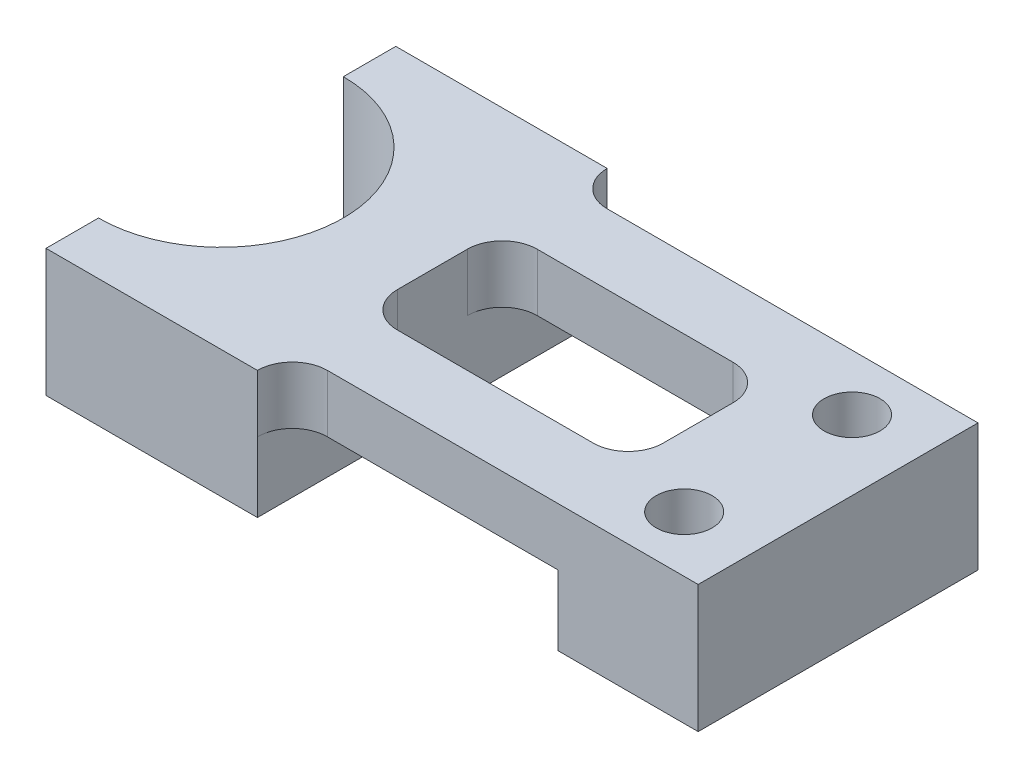
ISO-10303-21;
HEADER;
FILE_DESCRIPTION(('STEP AP214'),'2;1');
FILE_NAME('part.step','',(''),(''),'','','');
FILE_SCHEMA(('AUTOMOTIVE_DESIGN { 1 0 10303 214 1 1 1 1 }'));
ENDSEC;
DATA;
#1=APPLICATION_CONTEXT('core data for automotive mechanical design processes');
#2=APPLICATION_PROTOCOL_DEFINITION('international standard','automotive_design',2000,#1);
#3=PRODUCT_CONTEXT('',#1,'mechanical');
#4=PRODUCT('Part','Part','',(#3));
#5=PRODUCT_RELATED_PRODUCT_CATEGORY('part','',(#4));
#6=PRODUCT_DEFINITION_FORMATION('','',#4);
#7=PRODUCT_DEFINITION_CONTEXT('part definition',#1,'design');
#8=PRODUCT_DEFINITION('design','',#6,#7);
#9=PRODUCT_DEFINITION_SHAPE('','',#8);
#10=(LENGTH_UNIT() NAMED_UNIT(*) SI_UNIT(.MILLI.,.METRE.));
#11=(NAMED_UNIT(*) PLANE_ANGLE_UNIT() SI_UNIT($,.RADIAN.));
#12=(NAMED_UNIT(*) SI_UNIT($,.STERADIAN.) SOLID_ANGLE_UNIT());
#13=UNCERTAINTY_MEASURE_WITH_UNIT(LENGTH_MEASURE(1.E-05),#10,'distance_accuracy_value','');
#14=(GEOMETRIC_REPRESENTATION_CONTEXT(3) GLOBAL_UNCERTAINTY_ASSIGNED_CONTEXT((#13)) GLOBAL_UNIT_ASSIGNED_CONTEXT((#10,
#11,#12)) REPRESENTATION_CONTEXT('',''));
#15=CARTESIAN_POINT('',(0.,0.,0.));
#16=DIRECTION('',(0.,0.,1.));
#17=DIRECTION('',(1.,0.,0.));
#18=AXIS2_PLACEMENT_3D('',#15,#16,#17);
#19=CARTESIAN_POINT('',(0.,10.,0.));
#20=DIRECTION('',(0.,-1.,0.));
#21=DIRECTION('',(0.,0.,1.));
#22=AXIS2_PLACEMENT_3D('',#19,#20,#21);
#23=PLANE('',#22);
#24=DIRECTION('',(-1.,0.,0.));
#25=VECTOR('',#24,1.);
#26=CARTESIAN_POINT('',(0.,10.,-47.5797671138344));
#27=LINE('',#26,#25);
#28=CARTESIAN_POINT('',(39.8619055011397,10.,-47.5797671138343));
#29=VERTEX_POINT('',#28);
#30=CARTESIAN_POINT('',(11.8619055011397,10.,-47.5797671138344));
#31=VERTEX_POINT('',#30);
#32=EDGE_CURVE('E204',#29,#31,#27,.T.);
#33=ORIENTED_EDGE('',*,*,#32,.T.);
#34=CARTESIAN_POINT('',(11.8619055011397,10.,-42.5797671138344));
#35=DIRECTION('',(0.,1.,0.));
#36=DIRECTION('',(0.,0.,1.));
#37=AXIS2_PLACEMENT_3D('',#34,#35,#36);
#38=CIRCLE('',#37,5.);
#39=CARTESIAN_POINT('',(6.86190550113972,10.,-42.5797671138344));
#40=VERTEX_POINT('',#39);
#41=EDGE_CURVE('E311',#40,#31,#38,.F.);
#42=ORIENTED_EDGE('',*,*,#41,.F.);
#43=DIRECTION('',(0.,0.,1.));
#44=VECTOR('',#43,1.);
#45=CARTESIAN_POINT('',(6.86190550113972,10.,-62.5797671138344));
#46=LINE('',#45,#44);
#47=CARTESIAN_POINT('',(6.86190550113972,10.,-62.5797671138344));
#48=VERTEX_POINT('',#47);
#49=EDGE_CURVE('E234',#48,#40,#46,.T.);
#50=ORIENTED_EDGE('',*,*,#49,.F.);
#51=CARTESIAN_POINT('',(11.8619055011397,10.,-62.5797671138344));
#52=DIRECTION('',(0.,1.,0.));
#53=DIRECTION('',(0.,0.,1.));
#54=AXIS2_PLACEMENT_3D('',#51,#52,#53);
#55=CIRCLE('',#54,5.);
#56=CARTESIAN_POINT('',(11.8619055011397,10.,-57.5797671138344));
#57=VERTEX_POINT('',#56);
#58=EDGE_CURVE('E288',#57,#48,#55,.F.);
#59=ORIENTED_EDGE('',*,*,#58,.F.);
#60=DIRECTION('',(-1.,0.,0.));
#61=VECTOR('',#60,1.);
#62=CARTESIAN_POINT('',(0.,10.,-57.5797671138344));
#63=LINE('',#62,#61);
#64=CARTESIAN_POINT('',(44.8619055011397,10.,-57.5797671138344));
#65=VERTEX_POINT('',#64);
#66=EDGE_CURVE('E276',#65,#57,#63,.T.);
#67=ORIENTED_EDGE('',*,*,#66,.F.);
#68=DIRECTION('',(0.,0.,-1.));
#69=VECTOR('',#68,1.);
#70=CARTESIAN_POINT('',(44.8619055011397,10.,-62.5797671138344));
#71=LINE('',#70,#69);
#72=CARTESIAN_POINT('',(44.8619055011397,10.,-42.5797671138344));
#73=VERTEX_POINT('',#72);
#74=EDGE_CURVE('E237',#73,#65,#71,.T.);
#75=ORIENTED_EDGE('',*,*,#74,.F.);
#76=CARTESIAN_POINT('',(39.8619055011397,10.,-42.5797671138344));
#77=DIRECTION('',(0.,1.,0.));
#78=DIRECTION('',(0.,0.,1.));
#79=AXIS2_PLACEMENT_3D('',#76,#77,#78);
#80=CIRCLE('',#79,5.);
#81=EDGE_CURVE('E11',#29,#73,#80,.F.);
#82=ORIENTED_EDGE('',*,*,#81,.F.);
#83=EDGE_LOOP('',(#33,#42,#50,#59,#67,#75,#82));
#84=FACE_BOUND('',#83,.T.);
#85=ADVANCED_FACE('F35',(#84),#23,.T.);
#86=CARTESIAN_POINT('',(-23.3580944988603,18.22,-62.5797671138344));
#87=DIRECTION('',(1.,0.,0.));
#88=DIRECTION('',(0.,0.,1.));
#89=AXIS2_PLACEMENT_3D('',#86,#87,#88);
#90=PLANE('',#89);
#91=DIRECTION('',(0.,0.,-1.));
#92=VECTOR('',#91,1.);
#93=CARTESIAN_POINT('',(-23.3580944988603,0.,-62.5797671138344));
#94=LINE('',#93,#92);
#95=CARTESIAN_POINT('',(-23.3580944988603,0.,-12.5797671138344));
#96=VERTEX_POINT('',#95);
#97=CARTESIAN_POINT('',(-23.3580944988603,0.,-20.0797671138344));
#98=VERTEX_POINT('',#97);
#99=EDGE_CURVE('E197',#96,#98,#94,.T.);
#100=ORIENTED_EDGE('',*,*,#99,.F.);
#101=DIRECTION('',(0.,-1.,0.));
#102=VECTOR('',#101,1.);
#103=CARTESIAN_POINT('',(-23.3580944988603,18.22,-12.5797671138344));
#104=LINE('',#103,#102);
#105=CARTESIAN_POINT('',(-23.3580944988603,18.22,-12.5797671138344));
#106=VERTEX_POINT('',#105);
#107=EDGE_CURVE('E264',#106,#96,#104,.T.);
#108=ORIENTED_EDGE('',*,*,#107,.F.);
#109=DIRECTION('',(0.,0.,-1.));
#110=VECTOR('',#109,1.);
#111=CARTESIAN_POINT('',(-23.3580944988603,18.22,-62.5797671138344));
#112=LINE('',#111,#110);
#113=CARTESIAN_POINT('',(-23.3580944988603,18.22,-20.0797671138344));
#114=VERTEX_POINT('',#113);
#115=EDGE_CURVE('E253',#106,#114,#112,.T.);
#116=ORIENTED_EDGE('',*,*,#115,.T.);
#117=DIRECTION('',(0.,1.,0.));
#118=VECTOR('',#117,1.);
#119=CARTESIAN_POINT('',(-23.3580944988603,0.,-20.0797671138344));
#120=LINE('',#119,#118);
#121=EDGE_CURVE('E187',#98,#114,#120,.T.);
#122=ORIENTED_EDGE('',*,*,#121,.F.);
#123=EDGE_LOOP('',(#100,#108,#116,#122));
#124=FACE_BOUND('',#123,.T.);
#125=ADVANCED_FACE('F409',(#124),#90,.F.);
#126=CARTESIAN_POINT('',(64.8619055011397,18.22,-62.5797671138344));
#127=DIRECTION('',(-1.,0.,0.));
#128=DIRECTION('',(0.,0.,-1.));
#129=AXIS2_PLACEMENT_3D('',#126,#127,#128);
#130=PLANE('',#129);
#131=DIRECTION('',(0.,0.,1.));
#132=VECTOR('',#131,1.);
#133=CARTESIAN_POINT('',(64.8619055011397,0.,-62.5797671138344));
#134=LINE('',#133,#132);
#135=CARTESIAN_POINT('',(64.8619055011397,0.,-57.5797671138344));
#136=VERTEX_POINT('',#135);
#137=CARTESIAN_POINT('',(64.8619055011397,0.,-17.5797671138344));
#138=VERTEX_POINT('',#137);
#139=EDGE_CURVE('E268',#136,#138,#134,.T.);
#140=ORIENTED_EDGE('',*,*,#139,.F.);
#141=DIRECTION('',(0.,1.,0.));
#142=VECTOR('',#141,1.);
#143=CARTESIAN_POINT('',(64.8619055011397,0.,-57.5797671138344));
#144=LINE('',#143,#142);
#145=CARTESIAN_POINT('',(64.8619055011397,18.22,-57.5797671138344));
#146=VERTEX_POINT('',#145);
#147=EDGE_CURVE('E223',#136,#146,#144,.T.);
#148=ORIENTED_EDGE('',*,*,#147,.T.);
#149=DIRECTION('',(0.,0.,1.));
#150=VECTOR('',#149,1.);
#151=CARTESIAN_POINT('',(64.8619055011397,18.22,-62.5797671138344));
#152=LINE('',#151,#150);
#153=CARTESIAN_POINT('',(64.8619055011397,18.22,-17.5797671138344));
#154=VERTEX_POINT('',#153);
#155=EDGE_CURVE('E260',#146,#154,#152,.T.);
#156=ORIENTED_EDGE('',*,*,#155,.T.);
#157=DIRECTION('',(0.,-1.,0.));
#158=VECTOR('',#157,1.);
#159=CARTESIAN_POINT('',(64.8619055011397,0.,-17.5797671138344));
#160=LINE('',#159,#158);
#161=EDGE_CURVE('E210',#154,#138,#160,.T.);
#162=ORIENTED_EDGE('',*,*,#161,.T.);
#163=EDGE_LOOP('',(#140,#148,#156,#162));
#164=FACE_BOUND('',#163,.T.);
#165=ADVANCED_FACE('F367',(#164),#130,.F.);
#166=CARTESIAN_POINT('',(0.,0.,0.));
#167=DIRECTION('',(0.,-1.,0.));
#168=DIRECTION('',(0.,0.,1.));
#169=AXIS2_PLACEMENT_3D('',#166,#167,#168);
#170=PLANE('',#169);
#171=CARTESIAN_POINT('',(54.8619055011397,0.,-25.5797671138344));
#172=DIRECTION('',(0.,-1.,0.));
#173=DIRECTION('',(0.,0.,-1.));
#174=AXIS2_PLACEMENT_3D('',#171,#172,#173);
#175=CIRCLE('',#174,4.00000000000001);
#176=CARTESIAN_POINT('',(54.8619055011397,0.,-29.5797671138344));
#177=VERTEX_POINT('',#176);
#178=EDGE_CURVE('E351',#177,#177,#175,.T.);
#179=ORIENTED_EDGE('',*,*,#178,.F.);
#180=EDGE_LOOP('',(#179));
#181=FACE_BOUND('',#180,.T.);
#182=CARTESIAN_POINT('',(54.8619055011397,0.,-49.5797671138344));
#183=DIRECTION('',(0.,-1.,0.));
#184=DIRECTION('',(0.,0.,-1.));
#185=AXIS2_PLACEMENT_3D('',#182,#183,#184);
#186=CIRCLE('',#185,4.00000000000001);
#187=CARTESIAN_POINT('',(54.8619055011397,0.,-53.5797671138344));
#188=VERTEX_POINT('',#187);
#189=EDGE_CURVE('E347',#188,#188,#186,.T.);
#190=ORIENTED_EDGE('',*,*,#189,.F.);
#191=EDGE_LOOP('',(#190));
#192=FACE_BOUND('',#191,.T.);
#193=DIRECTION('',(-1.,0.,0.));
#194=VECTOR('',#193,1.);
#195=CARTESIAN_POINT('',(64.8619055011397,0.,-17.5797671138344));
#196=LINE('',#195,#194);
#197=CARTESIAN_POINT('',(44.8619055011397,0.,-17.5797671138344));
#198=VERTEX_POINT('',#197);
#199=EDGE_CURVE('E213',#138,#198,#196,.T.);
#200=ORIENTED_EDGE('',*,*,#199,.T.);
#201=DIRECTION('',(0.,0.,-1.));
#202=VECTOR('',#201,1.);
#203=CARTESIAN_POINT('',(44.8619055011397,0.,-62.5797671138344));
#204=LINE('',#203,#202);
#205=CARTESIAN_POINT('',(44.8619055011397,0.,-57.5797671138344));
#206=VERTEX_POINT('',#205);
#207=EDGE_CURVE('E245',#198,#206,#204,.T.);
#208=ORIENTED_EDGE('',*,*,#207,.T.);
#209=DIRECTION('',(1.,0.,0.));
#210=VECTOR('',#209,1.);
#211=CARTESIAN_POINT('',(64.8619055011397,0.,-57.5797671138344));
#212=LINE('',#211,#210);
#213=EDGE_CURVE('E229',#206,#136,#212,.T.);
#214=ORIENTED_EDGE('',*,*,#213,.T.);
#215=ORIENTED_EDGE('',*,*,#139,.T.);
#216=EDGE_LOOP('',(#200,#208,#214,#215));
#217=FACE_BOUND('',#216,.T.);
#218=ADVANCED_FACE('F363',(#181,#192,#217),#170,.T.);
#219=CARTESIAN_POINT('',(44.8619055011397,10.,-62.5797671138344));
#220=DIRECTION('',(1.,0.,0.));
#221=DIRECTION('',(0.,0.,1.));
#222=AXIS2_PLACEMENT_3D('',#219,#220,#221);
#223=PLANE('',#222);
#224=ORIENTED_EDGE('',*,*,#74,.T.);
#225=DIRECTION('',(0.,-1.,0.));
#226=VECTOR('',#225,1.);
#227=CARTESIAN_POINT('',(44.8619055011397,10.,-57.5797671138344));
#228=LINE('',#227,#226);
#229=EDGE_CURVE('E231',#65,#206,#228,.T.);
#230=ORIENTED_EDGE('',*,*,#229,.T.);
#231=ORIENTED_EDGE('',*,*,#207,.F.);
#232=DIRECTION('',(0.,-1.,0.));
#233=VECTOR('',#232,1.);
#234=CARTESIAN_POINT('',(44.8619055011397,10.,-17.5797671138344));
#235=LINE('',#234,#233);
#236=CARTESIAN_POINT('',(44.8619055011397,10.,-17.5797671138344));
#237=VERTEX_POINT('',#236);
#238=EDGE_CURVE('E221',#237,#198,#235,.T.);
#239=ORIENTED_EDGE('',*,*,#238,.F.);
#240=CARTESIAN_POINT('',(44.8619055011397,10.,-32.5797671138343));
#241=VERTEX_POINT('',#240);
#242=EDGE_CURVE('E239',#237,#241,#71,.T.);
#243=ORIENTED_EDGE('',*,*,#242,.T.);
#244=DIRECTION('',(0.,1.,0.));
#245=VECTOR('',#244,1.);
#246=CARTESIAN_POINT('',(44.8619055011397,10.,-32.5797671138343));
#247=LINE('',#246,#245);
#248=CARTESIAN_POINT('',(44.8619055011397,18.22,-32.5797671138343));
#249=VERTEX_POINT('',#248);
#250=EDGE_CURVE('E316',#249,#241,#247,.F.);
#251=ORIENTED_EDGE('',*,*,#250,.F.);
#252=DIRECTION('',(0.,0.,1.));
#253=VECTOR('',#252,1.);
#254=CARTESIAN_POINT('',(44.8619055011397,18.22,-47.5797671138343));
#255=LINE('',#254,#253);
#256=CARTESIAN_POINT('',(44.8619055011397,18.22,-42.5797671138344));
#257=VERTEX_POINT('',#256);
#258=EDGE_CURVE('E345',#257,#249,#255,.T.);
#259=ORIENTED_EDGE('',*,*,#258,.F.);
#260=DIRECTION('',(0.,1.,0.));
#261=VECTOR('',#260,1.);
#262=CARTESIAN_POINT('',(44.8619055011397,18.22,-42.5797671138344));
#263=LINE('',#262,#261);
#264=EDGE_CURVE('E324',#73,#257,#263,.T.);
#265=ORIENTED_EDGE('',*,*,#264,.F.);
#266=EDGE_LOOP('',(#224,#230,#231,#239,#243,#251,#259,#265));
#267=FACE_BOUND('',#266,.T.);
#268=ADVANCED_FACE('F366',(#267),#223,.F.);
#269=DIRECTION('',(1.,0.,0.));
#270=VECTOR('',#269,1.);
#271=CARTESIAN_POINT('',(0.,10.,-27.5797671138344));
#272=LINE('',#271,#270);
#273=CARTESIAN_POINT('',(11.8619055011397,10.,-27.5797671138343));
#274=VERTEX_POINT('',#273);
#275=CARTESIAN_POINT('',(39.8619055011397,10.,-27.5797671138343));
#276=VERTEX_POINT('',#275);
#277=EDGE_CURVE('E337',#274,#276,#272,.T.);
#278=ORIENTED_EDGE('',*,*,#277,.T.);
#279=CARTESIAN_POINT('',(39.8619055011397,10.,-32.5797671138343));
#280=DIRECTION('',(0.,1.,0.));
#281=DIRECTION('',(0.,0.,1.));
#282=AXIS2_PLACEMENT_3D('',#279,#280,#281);
#283=CIRCLE('',#282,5.);
#284=EDGE_CURVE('E321',#241,#276,#283,.F.);
#285=ORIENTED_EDGE('',*,*,#284,.F.);
#286=ORIENTED_EDGE('',*,*,#242,.F.);
#287=DIRECTION('',(-1.,0.,0.));
#288=VECTOR('',#287,1.);
#289=CARTESIAN_POINT('',(0.,10.,-17.5797671138344));
#290=LINE('',#289,#288);
#291=CARTESIAN_POINT('',(11.8619055011397,10.,-17.5797671138344));
#292=VERTEX_POINT('',#291);
#293=EDGE_CURVE('E218',#237,#292,#290,.T.);
#294=ORIENTED_EDGE('',*,*,#293,.T.);
#295=CARTESIAN_POINT('',(11.8619055011397,10.,-12.5797671138344));
#296=DIRECTION('',(0.,1.,0.));
#297=DIRECTION('',(0.,0.,1.));
#298=AXIS2_PLACEMENT_3D('',#295,#296,#297);
#299=CIRCLE('',#298,5.);
#300=CARTESIAN_POINT('',(6.86190550113972,10.,-12.5797671138344));
#301=VERTEX_POINT('',#300);
#302=EDGE_CURVE('E283',#301,#292,#299,.F.);
#303=ORIENTED_EDGE('',*,*,#302,.F.);
#304=CARTESIAN_POINT('',(6.86190550113972,10.,-32.5797671138344));
#305=VERTEX_POINT('',#304);
#306=EDGE_CURVE('E238',#305,#301,#46,.T.);
#307=ORIENTED_EDGE('',*,*,#306,.F.);
#308=CARTESIAN_POINT('',(11.8619055011397,10.,-32.5797671138344));
#309=DIRECTION('',(0.,1.,0.));
#310=DIRECTION('',(0.,0.,1.));
#311=AXIS2_PLACEMENT_3D('',#308,#309,#310);
#312=CIRCLE('',#311,5.);
#313=EDGE_CURVE('E301',#274,#305,#312,.F.);
#314=ORIENTED_EDGE('',*,*,#313,.F.);
#315=EDGE_LOOP('',(#278,#285,#286,#294,#303,#307,#314));
#316=FACE_BOUND('',#315,.T.);
#317=ADVANCED_FACE('F392',(#316),#23,.T.);
#318=CARTESIAN_POINT('',(-23.3580944988603,0.,-37.5797671138344));
#319=DIRECTION('',(0.,-1.,0.));
#320=DIRECTION('',(0.,0.,-1.));
#321=AXIS2_PLACEMENT_3D('',#318,#319,#320);
#322=CIRCLE('',#321,17.5);
#323=CARTESIAN_POINT('',(-23.3580944988603,0.,-55.0797671138344));
#324=VERTEX_POINT('',#323);
#325=EDGE_CURVE('E181',#324,#98,#322,.T.);
#326=ORIENTED_EDGE('',*,*,#325,.F.);
#327=CARTESIAN_POINT('',(-23.3580944988603,0.,-62.5797671138344));
#328=VERTEX_POINT('',#327);
#329=EDGE_CURVE('E190',#324,#328,#94,.T.);
#330=ORIENTED_EDGE('',*,*,#329,.T.);
#331=DIRECTION('',(1.,0.,0.));
#332=VECTOR('',#331,1.);
#333=CARTESIAN_POINT('',(-23.3580944988603,0.,-62.5797671138344));
#334=LINE('',#333,#332);
#335=CARTESIAN_POINT('',(6.86190550113972,0.,-62.5797671138344));
#336=VERTEX_POINT('',#335);
#337=EDGE_CURVE('E266',#328,#336,#334,.T.);
#338=ORIENTED_EDGE('',*,*,#337,.T.);
#339=DIRECTION('',(0.,0.,1.));
#340=VECTOR('',#339,1.);
#341=CARTESIAN_POINT('',(6.86190550113972,0.,-62.5797671138344));
#342=LINE('',#341,#340);
#343=CARTESIAN_POINT('',(6.86190550113972,0.,-12.5797671138344));
#344=VERTEX_POINT('',#343);
#345=EDGE_CURVE('E233',#336,#344,#342,.T.);
#346=ORIENTED_EDGE('',*,*,#345,.T.);
#347=DIRECTION('',(-1.,0.,0.));
#348=VECTOR('',#347,1.);
#349=CARTESIAN_POINT('',(-23.3580944988603,0.,-12.5797671138344));
#350=LINE('',#349,#348);
#351=EDGE_CURVE('E271',#344,#96,#350,.T.);
#352=ORIENTED_EDGE('',*,*,#351,.T.);
#353=ORIENTED_EDGE('',*,*,#99,.T.);
#354=EDGE_LOOP('',(#326,#330,#338,#346,#352,#353));
#355=FACE_BOUND('',#354,.T.);
#356=ADVANCED_FACE('F201',(#355),#170,.T.);
#357=CARTESIAN_POINT('',(-23.3580944988603,18.22,-55.0797671138344));
#358=VERTEX_POINT('',#357);
#359=CARTESIAN_POINT('',(-23.3580944988603,18.22,-62.5797671138344));
#360=VERTEX_POINT('',#359);
#361=EDGE_CURVE('E257',#358,#360,#112,.T.);
#362=ORIENTED_EDGE('',*,*,#361,.T.);
#363=DIRECTION('',(0.,-1.,0.));
#364=VECTOR('',#363,1.);
#365=CARTESIAN_POINT('',(-23.3580944988603,18.22,-62.5797671138344));
#366=LINE('',#365,#364);
#367=EDGE_CURVE('E193',#360,#328,#366,.T.);
#368=ORIENTED_EDGE('',*,*,#367,.T.);
#369=ORIENTED_EDGE('',*,*,#329,.F.);
#370=DIRECTION('',(0.,1.,0.));
#371=VECTOR('',#370,1.);
#372=CARTESIAN_POINT('',(-23.3580944988603,0.,-55.0797671138344));
#373=LINE('',#372,#371);
#374=EDGE_CURVE('E176',#358,#324,#373,.F.);
#375=ORIENTED_EDGE('',*,*,#374,.F.);
#376=EDGE_LOOP('',(#362,#368,#369,#375));
#377=FACE_BOUND('',#376,.T.);
#378=ADVANCED_FACE('F191',(#377),#90,.F.);
#379=CARTESIAN_POINT('',(-23.3580944988603,18.22,-62.5797671138344));
#380=DIRECTION('',(0.,0.,1.));
#381=DIRECTION('',(-1.,0.,0.));
#382=AXIS2_PLACEMENT_3D('',#379,#380,#381);
#383=PLANE('',#382);
#384=DIRECTION('',(0.,-1.,0.));
#385=VECTOR('',#384,1.);
#386=CARTESIAN_POINT('',(6.86190550113972,10.,-62.5797671138344));
#387=LINE('',#386,#385);
#388=CARTESIAN_POINT('',(6.86190550113972,18.22,-62.5797671138344));
#389=VERTEX_POINT('',#388);
#390=EDGE_CURVE('E198',#389,#48,#387,.T.);
#391=ORIENTED_EDGE('',*,*,#390,.T.);
#392=EDGE_CURVE('E250',#48,#336,#387,.T.);
#393=ORIENTED_EDGE('',*,*,#392,.T.);
#394=ORIENTED_EDGE('',*,*,#337,.F.);
#395=ORIENTED_EDGE('',*,*,#367,.F.);
#396=DIRECTION('',(1.,0.,0.));
#397=VECTOR('',#396,1.);
#398=CARTESIAN_POINT('',(-23.3580944988603,18.22,-62.5797671138344));
#399=LINE('',#398,#397);
#400=EDGE_CURVE('E256',#360,#389,#399,.T.);
#401=ORIENTED_EDGE('',*,*,#400,.T.);
#402=EDGE_LOOP('',(#391,#393,#394,#395,#401));
#403=FACE_BOUND('',#402,.T.);
#404=ADVANCED_FACE('F406',(#403),#383,.F.);
#405=CARTESIAN_POINT('',(-23.3580944988603,18.22,-12.5797671138344));
#406=DIRECTION('',(0.,0.,-1.));
#407=DIRECTION('',(1.,0.,0.));
#408=AXIS2_PLACEMENT_3D('',#405,#406,#407);
#409=PLANE('',#408);
#410=DIRECTION('',(-1.,0.,0.));
#411=VECTOR('',#410,1.);
#412=CARTESIAN_POINT('',(-23.3580944988603,18.22,-12.5797671138344));
#413=LINE('',#412,#411);
#414=CARTESIAN_POINT('',(6.86190550113972,18.22,-12.5797671138344));
#415=VERTEX_POINT('',#414);
#416=EDGE_CURVE('E263',#415,#106,#413,.T.);
#417=ORIENTED_EDGE('',*,*,#416,.T.);
#418=ORIENTED_EDGE('',*,*,#107,.T.);
#419=ORIENTED_EDGE('',*,*,#351,.F.);
#420=DIRECTION('',(0.,-1.,0.));
#421=VECTOR('',#420,1.);
#422=CARTESIAN_POINT('',(6.86190550113972,10.,-12.5797671138344));
#423=LINE('',#422,#421);
#424=EDGE_CURVE('E242',#301,#344,#423,.T.);
#425=ORIENTED_EDGE('',*,*,#424,.F.);
#426=EDGE_CURVE('E251',#415,#301,#423,.T.);
#427=ORIENTED_EDGE('',*,*,#426,.F.);
#428=EDGE_LOOP('',(#417,#418,#419,#425,#427));
#429=FACE_BOUND('',#428,.T.);
#430=ADVANCED_FACE('F412',(#429),#409,.F.);
#431=CARTESIAN_POINT('',(0.,18.22,0.));
#432=DIRECTION('',(0.,-1.,0.));
#433=DIRECTION('',(0.,0.,1.));
#434=AXIS2_PLACEMENT_3D('',#431,#432,#433);
#435=PLANE('',#434);
#436=CARTESIAN_POINT('',(54.8619055011397,18.22,-25.5797671138344));
#437=DIRECTION('',(0.,-1.,0.));
#438=DIRECTION('',(0.,0.,-1.));
#439=AXIS2_PLACEMENT_3D('',#436,#437,#438);
#440=CIRCLE('',#439,4.00000000000001);
#441=CARTESIAN_POINT('',(54.8619055011397,18.22,-29.5797671138344));
#442=VERTEX_POINT('',#441);
#443=EDGE_CURVE('E354',#442,#442,#440,.T.);
#444=ORIENTED_EDGE('',*,*,#443,.T.);
#445=EDGE_LOOP('',(#444));
#446=FACE_BOUND('',#445,.T.);
#447=CARTESIAN_POINT('',(54.8619055011397,18.22,-49.5797671138344));
#448=DIRECTION('',(0.,-1.,0.));
#449=DIRECTION('',(0.,0.,-1.));
#450=AXIS2_PLACEMENT_3D('',#447,#448,#449);
#451=CIRCLE('',#450,4.00000000000001);
#452=CARTESIAN_POINT('',(54.8619055011397,18.22,-53.5797671138344));
#453=VERTEX_POINT('',#452);
#454=EDGE_CURVE('E348',#453,#453,#451,.T.);
#455=ORIENTED_EDGE('',*,*,#454,.T.);
#456=EDGE_LOOP('',(#455));
#457=FACE_BOUND('',#456,.T.);
#458=DIRECTION('',(-1.,0.,0.));
#459=VECTOR('',#458,1.);
#460=CARTESIAN_POINT('',(44.8619055011397,18.22,-27.5797671138343));
#461=LINE('',#460,#459);
#462=CARTESIAN_POINT('',(39.8619055011397,18.22,-27.5797671138343));
#463=VERTEX_POINT('',#462);
#464=CARTESIAN_POINT('',(11.8619055011397,18.22,-27.5797671138344));
#465=VERTEX_POINT('',#464);
#466=EDGE_CURVE('E341',#463,#465,#461,.T.);
#467=ORIENTED_EDGE('',*,*,#466,.T.);
#468=CARTESIAN_POINT('',(11.8619055011397,18.22,-32.5797671138344));
#469=DIRECTION('',(0.,1.,0.));
#470=DIRECTION('',(0.,0.,1.));
#471=AXIS2_PLACEMENT_3D('',#468,#469,#470);
#472=CIRCLE('',#471,5.);
#473=CARTESIAN_POINT('',(6.86190550113971,18.22,-32.5797671138344));
#474=VERTEX_POINT('',#473);
#475=EDGE_CURVE('E298',#474,#465,#472,.T.);
#476=ORIENTED_EDGE('',*,*,#475,.F.);
#477=DIRECTION('',(0.,0.,-1.));
#478=VECTOR('',#477,1.);
#479=CARTESIAN_POINT('',(6.86190550113971,18.22,-47.5797671138344));
#480=LINE('',#479,#478);
#481=CARTESIAN_POINT('',(6.86190550113971,18.22,-42.5797671138344));
#482=VERTEX_POINT('',#481);
#483=EDGE_CURVE('E338',#474,#482,#480,.T.);
#484=ORIENTED_EDGE('',*,*,#483,.T.);
#485=CARTESIAN_POINT('',(11.8619055011397,18.22,-42.5797671138344));
#486=DIRECTION('',(0.,1.,0.));
#487=DIRECTION('',(0.,0.,1.));
#488=AXIS2_PLACEMENT_3D('',#485,#486,#487);
#489=CIRCLE('',#488,5.);
#490=CARTESIAN_POINT('',(11.8619055011397,18.22,-47.5797671138344));
#491=VERTEX_POINT('',#490);
#492=EDGE_CURVE('E308',#491,#482,#489,.T.);
#493=ORIENTED_EDGE('',*,*,#492,.F.);
#494=DIRECTION('',(1.,0.,0.));
#495=VECTOR('',#494,1.);
#496=CARTESIAN_POINT('',(44.8619055011397,18.22,-47.5797671138343));
#497=LINE('',#496,#495);
#498=CARTESIAN_POINT('',(39.8619055011397,18.22,-47.5797671138343));
#499=VERTEX_POINT('',#498);
#500=EDGE_CURVE('E332',#491,#499,#497,.T.);
#501=ORIENTED_EDGE('',*,*,#500,.T.);
#502=CARTESIAN_POINT('',(39.8619055011397,18.22,-42.5797671138344));
#503=DIRECTION('',(0.,1.,0.));
#504=DIRECTION('',(0.,0.,1.));
#505=AXIS2_PLACEMENT_3D('',#502,#503,#504);
#506=CIRCLE('',#505,5.);
#507=EDGE_CURVE('E43',#257,#499,#506,.T.);
#508=ORIENTED_EDGE('',*,*,#507,.F.);
#509=ORIENTED_EDGE('',*,*,#258,.T.);
#510=CARTESIAN_POINT('',(39.8619055011397,18.22,-32.5797671138343));
#511=DIRECTION('',(0.,1.,0.));
#512=DIRECTION('',(0.,0.,1.));
#513=AXIS2_PLACEMENT_3D('',#510,#511,#512);
#514=CIRCLE('',#513,5.);
#515=EDGE_CURVE('E319',#463,#249,#514,.T.);
#516=ORIENTED_EDGE('',*,*,#515,.F.);
#517=EDGE_LOOP('',(#467,#476,#484,#493,#501,#508,#509,#516));
#518=FACE_BOUND('',#517,.T.);
#519=ORIENTED_EDGE('',*,*,#115,.F.);
#520=ORIENTED_EDGE('',*,*,#416,.F.);
#521=CARTESIAN_POINT('',(11.8619055011397,18.22,-12.5797671138344));
#522=DIRECTION('',(0.,1.,0.));
#523=DIRECTION('',(0.,0.,1.));
#524=AXIS2_PLACEMENT_3D('',#521,#522,#523);
#525=CIRCLE('',#524,5.);
#526=CARTESIAN_POINT('',(11.8619055011397,18.22,-17.5797671138344));
#527=VERTEX_POINT('',#526);
#528=EDGE_CURVE('E281',#527,#415,#525,.T.);
#529=ORIENTED_EDGE('',*,*,#528,.F.);
#530=DIRECTION('',(1.,0.,0.));
#531=VECTOR('',#530,1.);
#532=CARTESIAN_POINT('',(64.8619055011397,18.22,-17.5797671138344));
#533=LINE('',#532,#531);
#534=EDGE_CURVE('E216',#527,#154,#533,.T.);
#535=ORIENTED_EDGE('',*,*,#534,.T.);
#536=ORIENTED_EDGE('',*,*,#155,.F.);
#537=DIRECTION('',(-1.,0.,0.));
#538=VECTOR('',#537,1.);
#539=CARTESIAN_POINT('',(64.8619055011397,18.22,-57.5797671138344));
#540=LINE('',#539,#538);
#541=CARTESIAN_POINT('',(11.8619055011397,18.22,-57.5797671138344));
#542=VERTEX_POINT('',#541);
#543=EDGE_CURVE('E226',#146,#542,#540,.T.);
#544=ORIENTED_EDGE('',*,*,#543,.T.);
#545=CARTESIAN_POINT('',(11.8619055011397,18.22,-62.5797671138344));
#546=DIRECTION('',(0.,1.,0.));
#547=DIRECTION('',(0.,0.,1.));
#548=AXIS2_PLACEMENT_3D('',#545,#546,#547);
#549=CIRCLE('',#548,5.);
#550=EDGE_CURVE('E291',#389,#542,#549,.T.);
#551=ORIENTED_EDGE('',*,*,#550,.F.);
#552=ORIENTED_EDGE('',*,*,#400,.F.);
#553=ORIENTED_EDGE('',*,*,#361,.F.);
#554=CARTESIAN_POINT('',(-23.3580944988603,18.22,-37.5797671138344));
#555=DIRECTION('',(0.,-1.,0.));
#556=DIRECTION('',(0.,0.,-1.));
#557=AXIS2_PLACEMENT_3D('',#554,#555,#556);
#558=CIRCLE('',#557,17.5);
#559=EDGE_CURVE('E183',#358,#114,#558,.T.);
#560=ORIENTED_EDGE('',*,*,#559,.T.);
#561=EDGE_LOOP('',(#519,#520,#529,#535,#536,#544,#551,#552,#553,#560));
#562=FACE_BOUND('',#561,.T.);
#563=ADVANCED_FACE('F334',(#446,#457,#518,#562),#435,.F.);
#564=CARTESIAN_POINT('',(6.86190550113972,10.,-62.5797671138344));
#565=DIRECTION('',(-1.,0.,0.));
#566=DIRECTION('',(0.,0.,-1.));
#567=AXIS2_PLACEMENT_3D('',#564,#565,#566);
#568=PLANE('',#567);
#569=ORIENTED_EDGE('',*,*,#483,.F.);
#570=DIRECTION('',(0.,1.,0.));
#571=VECTOR('',#570,1.);
#572=CARTESIAN_POINT('',(6.86190550113972,18.22,-32.5797671138344));
#573=LINE('',#572,#571);
#574=EDGE_CURVE('E294',#305,#474,#573,.T.);
#575=ORIENTED_EDGE('',*,*,#574,.F.);
#576=ORIENTED_EDGE('',*,*,#306,.T.);
#577=ORIENTED_EDGE('',*,*,#424,.T.);
#578=ORIENTED_EDGE('',*,*,#345,.F.);
#579=ORIENTED_EDGE('',*,*,#392,.F.);
#580=ORIENTED_EDGE('',*,*,#49,.T.);
#581=DIRECTION('',(0.,1.,0.));
#582=VECTOR('',#581,1.);
#583=CARTESIAN_POINT('',(6.86190550113972,10.,-42.5797671138344));
#584=LINE('',#583,#582);
#585=EDGE_CURVE('E306',#482,#40,#584,.F.);
#586=ORIENTED_EDGE('',*,*,#585,.F.);
#587=EDGE_LOOP('',(#569,#575,#576,#577,#578,#579,#580,#586));
#588=FACE_BOUND('',#587,.T.);
#589=ADVANCED_FACE('F417',(#588),#568,.F.);
#590=CARTESIAN_POINT('',(0.,0.,-57.5797671138344));
#591=DIRECTION('',(0.,0.,-1.));
#592=DIRECTION('',(1.,0.,0.));
#593=AXIS2_PLACEMENT_3D('',#590,#591,#592);
#594=PLANE('',#593);
#595=ORIENTED_EDGE('',*,*,#543,.F.);
#596=ORIENTED_EDGE('',*,*,#147,.F.);
#597=ORIENTED_EDGE('',*,*,#213,.F.);
#598=ORIENTED_EDGE('',*,*,#229,.F.);
#599=ORIENTED_EDGE('',*,*,#66,.T.);
#600=DIRECTION('',(0.,-1.,0.));
#601=VECTOR('',#600,1.);
#602=CARTESIAN_POINT('',(11.8619055011397,0.,-57.5797671138344));
#603=LINE('',#602,#601);
#604=EDGE_CURVE('E286',#542,#57,#603,.T.);
#605=ORIENTED_EDGE('',*,*,#604,.F.);
#606=EDGE_LOOP('',(#595,#596,#597,#598,#599,#605));
#607=FACE_BOUND('',#606,.T.);
#608=ADVANCED_FACE('F400',(#607),#594,.T.);
#609=CARTESIAN_POINT('',(0.,0.,-17.5797671138344));
#610=DIRECTION('',(0.,0.,-1.));
#611=DIRECTION('',(1.,0.,0.));
#612=AXIS2_PLACEMENT_3D('',#609,#610,#611);
#613=PLANE('',#612);
#614=ORIENTED_EDGE('',*,*,#293,.F.);
#615=ORIENTED_EDGE('',*,*,#238,.T.);
#616=ORIENTED_EDGE('',*,*,#199,.F.);
#617=ORIENTED_EDGE('',*,*,#161,.F.);
#618=ORIENTED_EDGE('',*,*,#534,.F.);
#619=DIRECTION('',(0.,1.,0.));
#620=VECTOR('',#619,1.);
#621=CARTESIAN_POINT('',(11.8619055011397,18.22,-17.5797671138344));
#622=LINE('',#621,#620);
#623=EDGE_CURVE('E279',#292,#527,#622,.T.);
#624=ORIENTED_EDGE('',*,*,#623,.F.);
#625=EDGE_LOOP('',(#614,#615,#616,#617,#618,#624));
#626=FACE_BOUND('',#625,.T.);
#627=ADVANCED_FACE('F375',(#626),#613,.F.);
#628=CARTESIAN_POINT('',(11.8619055011397,0.,-12.5797671138344));
#629=DIRECTION('',(0.,-1.,0.));
#630=DIRECTION('',(0.,0.,1.));
#631=AXIS2_PLACEMENT_3D('',#628,#629,#630);
#632=CYLINDRICAL_SURFACE('',#631,5.);
#633=ORIENTED_EDGE('',*,*,#302,.T.);
#634=ORIENTED_EDGE('',*,*,#623,.T.);
#635=ORIENTED_EDGE('',*,*,#528,.T.);
#636=ORIENTED_EDGE('',*,*,#426,.T.);
#637=EDGE_LOOP('',(#633,#634,#635,#636));
#638=FACE_BOUND('',#637,.T.);
#639=ADVANCED_FACE('F387',(#638),#632,.F.);
#640=CARTESIAN_POINT('',(11.8619055011397,0.,-62.5797671138344));
#641=DIRECTION('',(0.,-1.,0.));
#642=DIRECTION('',(0.,0.,1.));
#643=AXIS2_PLACEMENT_3D('',#640,#641,#642);
#644=CYLINDRICAL_SURFACE('',#643,5.);
#645=ORIENTED_EDGE('',*,*,#550,.T.);
#646=ORIENTED_EDGE('',*,*,#604,.T.);
#647=ORIENTED_EDGE('',*,*,#58,.T.);
#648=ORIENTED_EDGE('',*,*,#390,.F.);
#649=EDGE_LOOP('',(#645,#646,#647,#648));
#650=FACE_BOUND('',#649,.T.);
#651=ADVANCED_FACE('F404',(#650),#644,.F.);
#652=CARTESIAN_POINT('',(-23.3580944988603,0.,-37.5797671138344));
#653=DIRECTION('',(0.,1.,0.));
#654=DIRECTION('',(0.,0.,-1.));
#655=AXIS2_PLACEMENT_3D('',#652,#653,#654);
#656=CYLINDRICAL_SURFACE('',#655,17.5);
#657=ORIENTED_EDGE('',*,*,#325,.T.);
#658=ORIENTED_EDGE('',*,*,#121,.T.);
#659=ORIENTED_EDGE('',*,*,#559,.F.);
#660=ORIENTED_EDGE('',*,*,#374,.T.);
#661=EDGE_LOOP('',(#657,#658,#659,#660));
#662=FACE_BOUND('',#661,.T.);
#663=ADVANCED_FACE('F178',(#662),#656,.F.);
#664=CARTESIAN_POINT('',(44.8619055011397,0.,-47.5797671138343));
#665=DIRECTION('',(0.,0.,-1.));
#666=DIRECTION('',(1.,0.,0.));
#667=AXIS2_PLACEMENT_3D('',#664,#665,#666);
#668=PLANE('',#667);
#669=ORIENTED_EDGE('',*,*,#500,.F.);
#670=DIRECTION('',(0.,1.,0.));
#671=VECTOR('',#670,1.);
#672=CARTESIAN_POINT('',(11.8619055011397,18.22,-47.5797671138344));
#673=LINE('',#672,#671);
#674=EDGE_CURVE('E304',#31,#491,#673,.T.);
#675=ORIENTED_EDGE('',*,*,#674,.F.);
#676=ORIENTED_EDGE('',*,*,#32,.F.);
#677=DIRECTION('',(0.,1.,0.));
#678=VECTOR('',#677,1.);
#679=CARTESIAN_POINT('',(39.8619055011397,10.,-47.5797671138343));
#680=LINE('',#679,#678);
#681=EDGE_CURVE('E50',#499,#29,#680,.F.);
#682=ORIENTED_EDGE('',*,*,#681,.F.);
#683=EDGE_LOOP('',(#669,#675,#676,#682));
#684=FACE_BOUND('',#683,.T.);
#685=ADVANCED_FACE('F434',(#684),#668,.F.);
#686=CARTESIAN_POINT('',(44.8619055011397,0.,-27.5797671138343));
#687=DIRECTION('',(0.,0.,1.));
#688=DIRECTION('',(-1.,0.,0.));
#689=AXIS2_PLACEMENT_3D('',#686,#687,#688);
#690=PLANE('',#689);
#691=ORIENTED_EDGE('',*,*,#277,.F.);
#692=DIRECTION('',(0.,1.,0.));
#693=VECTOR('',#692,1.);
#694=CARTESIAN_POINT('',(11.8619055011397,10.,-27.5797671138344));
#695=LINE('',#694,#693);
#696=EDGE_CURVE('E296',#465,#274,#695,.F.);
#697=ORIENTED_EDGE('',*,*,#696,.F.);
#698=ORIENTED_EDGE('',*,*,#466,.F.);
#699=DIRECTION('',(0.,1.,0.));
#700=VECTOR('',#699,1.);
#701=CARTESIAN_POINT('',(39.8619055011397,18.22,-27.5797671138343));
#702=LINE('',#701,#700);
#703=EDGE_CURVE('E314',#276,#463,#702,.T.);
#704=ORIENTED_EDGE('',*,*,#703,.F.);
#705=EDGE_LOOP('',(#691,#697,#698,#704));
#706=FACE_BOUND('',#705,.T.);
#707=ADVANCED_FACE('F422',(#706),#690,.F.);
#708=CARTESIAN_POINT('',(11.8619055011397,10.,-32.5797671138344));
#709=DIRECTION('',(0.,-1.,0.));
#710=DIRECTION('',(0.,0.,1.));
#711=AXIS2_PLACEMENT_3D('',#708,#709,#710);
#712=CYLINDRICAL_SURFACE('',#711,5.);
#713=ORIENTED_EDGE('',*,*,#313,.T.);
#714=ORIENTED_EDGE('',*,*,#574,.T.);
#715=ORIENTED_EDGE('',*,*,#475,.T.);
#716=ORIENTED_EDGE('',*,*,#696,.T.);
#717=EDGE_LOOP('',(#713,#714,#715,#716));
#718=FACE_BOUND('',#717,.T.);
#719=ADVANCED_FACE('F428',(#718),#712,.F.);
#720=CARTESIAN_POINT('',(11.8619055011397,0.,-42.5797671138344));
#721=DIRECTION('',(0.,-1.,0.));
#722=DIRECTION('',(0.,0.,1.));
#723=AXIS2_PLACEMENT_3D('',#720,#721,#722);
#724=CYLINDRICAL_SURFACE('',#723,5.);
#725=ORIENTED_EDGE('',*,*,#41,.T.);
#726=ORIENTED_EDGE('',*,*,#674,.T.);
#727=ORIENTED_EDGE('',*,*,#492,.T.);
#728=ORIENTED_EDGE('',*,*,#585,.T.);
#729=EDGE_LOOP('',(#725,#726,#727,#728));
#730=FACE_BOUND('',#729,.T.);
#731=ADVANCED_FACE('F432',(#730),#724,.F.);
#732=CARTESIAN_POINT('',(39.8619055011397,0.,-32.5797671138343));
#733=DIRECTION('',(0.,-1.,0.));
#734=DIRECTION('',(0.,0.,1.));
#735=AXIS2_PLACEMENT_3D('',#732,#733,#734);
#736=CYLINDRICAL_SURFACE('',#735,5.);
#737=ORIENTED_EDGE('',*,*,#284,.T.);
#738=ORIENTED_EDGE('',*,*,#703,.T.);
#739=ORIENTED_EDGE('',*,*,#515,.T.);
#740=ORIENTED_EDGE('',*,*,#250,.T.);
#741=EDGE_LOOP('',(#737,#738,#739,#740));
#742=FACE_BOUND('',#741,.T.);
#743=ADVANCED_FACE('F426',(#742),#736,.F.);
#744=CARTESIAN_POINT('',(39.8619055011397,10.,-42.5797671138344));
#745=DIRECTION('',(0.,-1.,0.));
#746=DIRECTION('',(0.,0.,1.));
#747=AXIS2_PLACEMENT_3D('',#744,#745,#746);
#748=CYLINDRICAL_SURFACE('',#747,5.);
#749=ORIENTED_EDGE('',*,*,#81,.T.);
#750=ORIENTED_EDGE('',*,*,#264,.T.);
#751=ORIENTED_EDGE('',*,*,#507,.T.);
#752=ORIENTED_EDGE('',*,*,#681,.T.);
#753=EDGE_LOOP('',(#749,#750,#751,#752));
#754=FACE_BOUND('',#753,.T.);
#755=ADVANCED_FACE('F37',(#754),#748,.F.);
#756=CARTESIAN_POINT('',(54.8619055011397,0.,-49.5797671138344));
#757=DIRECTION('',(0.,1.,0.));
#758=DIRECTION('',(0.,0.,-1.));
#759=AXIS2_PLACEMENT_3D('',#756,#757,#758);
#760=CYLINDRICAL_SURFACE('',#759,4.00000000000001);
#761=ORIENTED_EDGE('',*,*,#189,.T.);
#762=EDGE_LOOP('',(#761));
#763=FACE_BOUND('',#762,.T.);
#764=ORIENTED_EDGE('',*,*,#454,.F.);
#765=EDGE_LOOP('',(#764));
#766=FACE_BOUND('',#765,.T.);
#767=ADVANCED_FACE('F475',(#763,#766),#760,.F.);
#768=CARTESIAN_POINT('',(54.8619055011397,0.,-25.5797671138344));
#769=DIRECTION('',(0.,1.,0.));
#770=DIRECTION('',(0.,0.,-1.));
#771=AXIS2_PLACEMENT_3D('',#768,#769,#770);
#772=CYLINDRICAL_SURFACE('',#771,4.00000000000001);
#773=ORIENTED_EDGE('',*,*,#178,.T.);
#774=EDGE_LOOP('',(#773));
#775=FACE_BOUND('',#774,.T.);
#776=ORIENTED_EDGE('',*,*,#443,.F.);
#777=EDGE_LOOP('',(#776));
#778=FACE_BOUND('',#777,.T.);
#779=ADVANCED_FACE('F360',(#775,#778),#772,.F.);
#780=CLOSED_SHELL('',(#85,#125,#165,#218,#268,#317,#356,#378,#404,#430,#563,#589,#608,#627,#639,
#651,#663,#685,#707,#719,#731,#743,#755,#767,#779));
#781=MANIFOLD_SOLID_BREP('B2',#780);
#782=ADVANCED_BREP_SHAPE_REPRESENTATION('',(#18,#781),#14);
#783=SHAPE_DEFINITION_REPRESENTATION(#9,#782);
ENDSEC;
END-ISO-10303-21;
